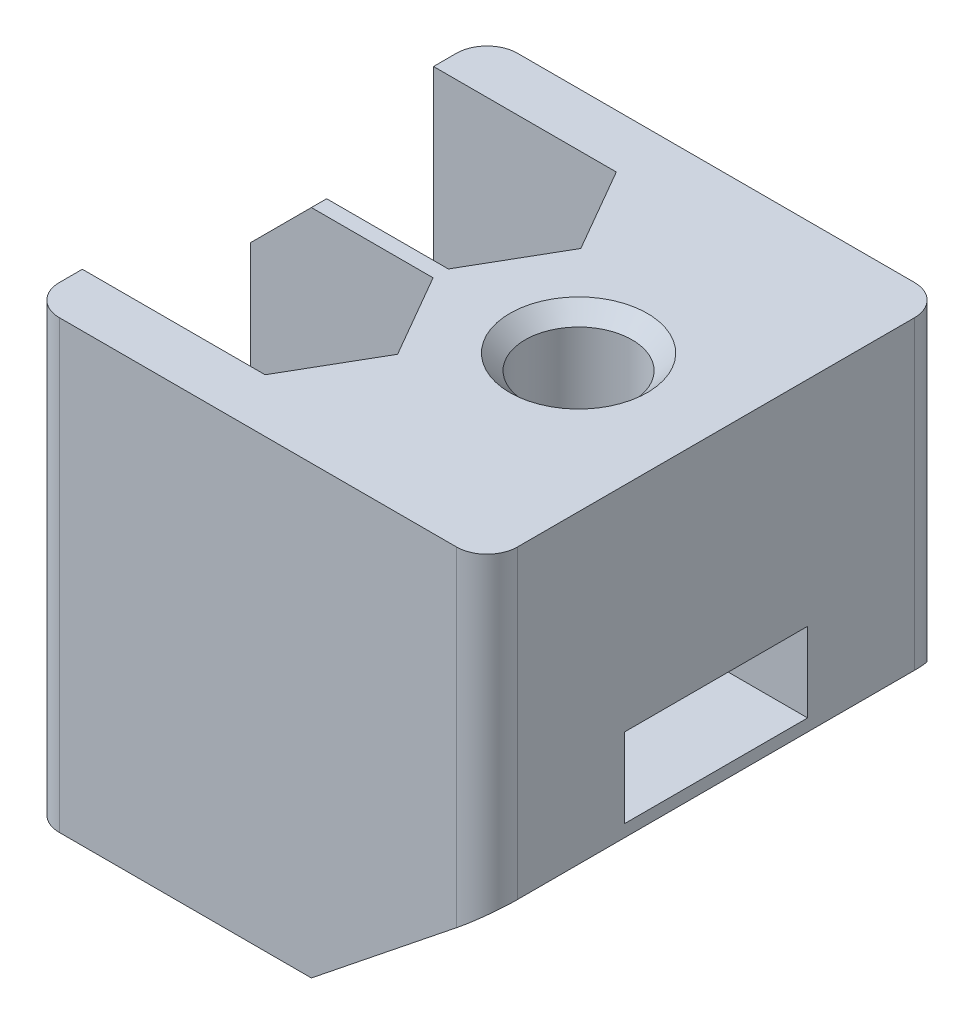
ISO-10303-21;
HEADER;
FILE_DESCRIPTION(('STEP AP214'),'2;1');
FILE_NAME('part.step','',(''),(''),'','','');
FILE_SCHEMA(('AUTOMOTIVE_DESIGN { 1 0 10303 214 1 1 1 1 }'));
ENDSEC;
DATA;
#1=APPLICATION_CONTEXT('core data for automotive mechanical design processes');
#2=APPLICATION_PROTOCOL_DEFINITION('international standard','automotive_design',2000,#1);
#3=PRODUCT_CONTEXT('',#1,'mechanical');
#4=PRODUCT('Part','Part','',(#3));
#5=PRODUCT_RELATED_PRODUCT_CATEGORY('part','',(#4));
#6=PRODUCT_DEFINITION_FORMATION('','',#4);
#7=PRODUCT_DEFINITION_CONTEXT('part definition',#1,'design');
#8=PRODUCT_DEFINITION('design','',#6,#7);
#9=PRODUCT_DEFINITION_SHAPE('','',#8);
#10=(LENGTH_UNIT() NAMED_UNIT(*) SI_UNIT(.MILLI.,.METRE.));
#11=(NAMED_UNIT(*) PLANE_ANGLE_UNIT() SI_UNIT($,.RADIAN.));
#12=(NAMED_UNIT(*) SI_UNIT($,.STERADIAN.) SOLID_ANGLE_UNIT());
#13=UNCERTAINTY_MEASURE_WITH_UNIT(LENGTH_MEASURE(1.E-05),#10,'distance_accuracy_value','');
#14=(GEOMETRIC_REPRESENTATION_CONTEXT(3) GLOBAL_UNCERTAINTY_ASSIGNED_CONTEXT((#13)) GLOBAL_UNIT_ASSIGNED_CONTEXT((#10,
#11,#12)) REPRESENTATION_CONTEXT('',''));
#15=CARTESIAN_POINT('',(0.,0.,0.));
#16=DIRECTION('',(0.,0.,1.));
#17=DIRECTION('',(1.,0.,0.));
#18=AXIS2_PLACEMENT_3D('',#15,#16,#17);
#19=CARTESIAN_POINT('',(1.26794919243112,1.3,3.));
#20=DIRECTION('',(0.,0.,1.));
#21=DIRECTION('',(1.,0.,0.));
#22=AXIS2_PLACEMENT_3D('',#19,#20,#21);
#23=PLANE('',#22);
#24=DIRECTION('',(-1.,0.,0.));
#25=VECTOR('',#24,1.);
#26=CARTESIAN_POINT('',(1.26794919243112,-1.3,3.));
#27=LINE('',#26,#25);
#28=CARTESIAN_POINT('',(7.5,-1.3,3.));
#29=VERTEX_POINT('',#28);
#30=CARTESIAN_POINT('',(1.26794919243112,-1.3,3.));
#31=VERTEX_POINT('',#30);
#32=EDGE_CURVE('E334',#29,#31,#27,.T.);
#33=ORIENTED_EDGE('',*,*,#32,.T.);
#34=DIRECTION('',(0.,-1.,0.));
#35=VECTOR('',#34,1.);
#36=CARTESIAN_POINT('',(1.26794919243112,1.3,3.));
#37=LINE('',#36,#35);
#38=CARTESIAN_POINT('',(1.26794919243112,1.3,3.));
#39=VERTEX_POINT('',#38);
#40=EDGE_CURVE('E367',#39,#31,#37,.T.);
#41=ORIENTED_EDGE('',*,*,#40,.F.);
#42=DIRECTION('',(-1.,0.,0.));
#43=VECTOR('',#42,1.);
#44=CARTESIAN_POINT('',(4.73205080756888,1.3,3.));
#45=LINE('',#44,#43);
#46=CARTESIAN_POINT('',(7.5,1.3,3.));
#47=VERTEX_POINT('',#46);
#48=EDGE_CURVE('E335',#47,#39,#45,.T.);
#49=ORIENTED_EDGE('',*,*,#48,.F.);
#50=DIRECTION('',(0.,-1.,0.));
#51=VECTOR('',#50,1.);
#52=CARTESIAN_POINT('',(7.5,1.3,3.));
#53=LINE('',#52,#51);
#54=EDGE_CURVE('E370',#47,#29,#53,.T.);
#55=ORIENTED_EDGE('',*,*,#54,.T.);
#56=EDGE_LOOP('',(#33,#41,#49,#55));
#57=FACE_BOUND('',#56,.T.);
#58=ADVANCED_FACE('F37',(#57),#23,.F.);
#59=CARTESIAN_POINT('',(-0.464101615137755,1.3,0.));
#60=DIRECTION('',(-0.866025403784438,0.,0.5));
#61=DIRECTION('',(0.5,0.,0.866025403784439));
#62=AXIS2_PLACEMENT_3D('',#59,#60,#61);
#63=PLANE('',#62);
#64=DIRECTION('',(-0.5,0.,-0.866025403784438));
#65=VECTOR('',#64,1.);
#66=CARTESIAN_POINT('',(-0.464101615137755,-1.3,0.));
#67=LINE('',#66,#65);
#68=CARTESIAN_POINT('',(-0.464101615137755,-1.3,0.));
#69=VERTEX_POINT('',#68);
#70=EDGE_CURVE('E351',#31,#69,#67,.T.);
#71=ORIENTED_EDGE('',*,*,#70,.T.);
#72=DIRECTION('',(0.,-1.,0.));
#73=VECTOR('',#72,1.);
#74=CARTESIAN_POINT('',(-0.464101615137755,1.3,0.));
#75=LINE('',#74,#73);
#76=CARTESIAN_POINT('',(-0.464101615137755,1.3,0.));
#77=VERTEX_POINT('',#76);
#78=EDGE_CURVE('E364',#77,#69,#75,.T.);
#79=ORIENTED_EDGE('',*,*,#78,.F.);
#80=DIRECTION('',(-0.5,0.,-0.866025403784438));
#81=VECTOR('',#80,1.);
#82=CARTESIAN_POINT('',(-0.464101615137755,1.3,0.));
#83=LINE('',#82,#81);
#84=EDGE_CURVE('E338',#39,#77,#83,.T.);
#85=ORIENTED_EDGE('',*,*,#84,.F.);
#86=ORIENTED_EDGE('',*,*,#40,.T.);
#87=EDGE_LOOP('',(#71,#79,#85,#86));
#88=FACE_BOUND('',#87,.T.);
#89=ADVANCED_FACE('F520',(#88),#63,.F.);
#90=CARTESIAN_POINT('',(1.26794919243112,1.3,-3.));
#91=DIRECTION('',(-0.866025403784439,0.,-0.5));
#92=DIRECTION('',(-0.5,0.,0.866025403784439));
#93=AXIS2_PLACEMENT_3D('',#90,#91,#92);
#94=PLANE('',#93);
#95=DIRECTION('',(0.5,0.,-0.866025403784439));
#96=VECTOR('',#95,1.);
#97=CARTESIAN_POINT('',(1.26794919243112,-1.3,-3.));
#98=LINE('',#97,#96);
#99=CARTESIAN_POINT('',(1.26794919243112,-1.3,-3.));
#100=VERTEX_POINT('',#99);
#101=EDGE_CURVE('E354',#69,#100,#98,.T.);
#102=ORIENTED_EDGE('',*,*,#101,.T.);
#103=DIRECTION('',(0.,-1.,0.));
#104=VECTOR('',#103,1.);
#105=CARTESIAN_POINT('',(1.26794919243112,1.3,-3.));
#106=LINE('',#105,#104);
#107=CARTESIAN_POINT('',(1.26794919243112,1.3,-3.));
#108=VERTEX_POINT('',#107);
#109=EDGE_CURVE('E361',#108,#100,#106,.T.);
#110=ORIENTED_EDGE('',*,*,#109,.F.);
#111=DIRECTION('',(0.5,0.,-0.866025403784439));
#112=VECTOR('',#111,1.);
#113=CARTESIAN_POINT('',(1.26794919243112,1.3,-3.));
#114=LINE('',#113,#112);
#115=EDGE_CURVE('E342',#77,#108,#114,.T.);
#116=ORIENTED_EDGE('',*,*,#115,.F.);
#117=ORIENTED_EDGE('',*,*,#78,.T.);
#118=EDGE_LOOP('',(#102,#110,#116,#117));
#119=FACE_BOUND('',#118,.T.);
#120=ADVANCED_FACE('F526',(#119),#94,.F.);
#121=CARTESIAN_POINT('',(4.73205080756888,1.3,-3.));
#122=DIRECTION('',(0.,0.,-1.));
#123=DIRECTION('',(-1.,0.,0.));
#124=AXIS2_PLACEMENT_3D('',#121,#122,#123);
#125=PLANE('',#124);
#126=DIRECTION('',(1.,0.,0.));
#127=VECTOR('',#126,1.);
#128=CARTESIAN_POINT('',(4.73205080756888,-1.3,-3.));
#129=LINE('',#128,#127);
#130=CARTESIAN_POINT('',(7.5,-1.3,-3.));
#131=VERTEX_POINT('',#130);
#132=EDGE_CURVE('E339',#100,#131,#129,.T.);
#133=ORIENTED_EDGE('',*,*,#132,.T.);
#134=DIRECTION('',(0.,-1.,0.));
#135=VECTOR('',#134,1.);
#136=CARTESIAN_POINT('',(7.5,1.3,-3.));
#137=LINE('',#136,#135);
#138=CARTESIAN_POINT('',(7.5,1.3,-3.));
#139=VERTEX_POINT('',#138);
#140=EDGE_CURVE('E348',#139,#131,#137,.T.);
#141=ORIENTED_EDGE('',*,*,#140,.F.);
#142=DIRECTION('',(1.,0.,0.));
#143=VECTOR('',#142,1.);
#144=CARTESIAN_POINT('',(4.73205080756888,1.3,-3.));
#145=LINE('',#144,#143);
#146=EDGE_CURVE('E345',#108,#139,#145,.T.);
#147=ORIENTED_EDGE('',*,*,#146,.F.);
#148=ORIENTED_EDGE('',*,*,#109,.T.);
#149=EDGE_LOOP('',(#133,#141,#147,#148));
#150=FACE_BOUND('',#149,.T.);
#151=ADVANCED_FACE('F696',(#150),#125,.F.);
#152=CARTESIAN_POINT('',(7.5,1.3,-7.5));
#153=DIRECTION('',(-1.,0.,0.));
#154=DIRECTION('',(0.,0.,1.));
#155=AXIS2_PLACEMENT_3D('',#152,#153,#154);
#156=PLANE('',#155);
#157=DIRECTION('',(0.,0.,1.));
#158=VECTOR('',#157,1.);
#159=CARTESIAN_POINT('',(7.5,-1.3,3.));
#160=LINE('',#159,#158);
#161=EDGE_CURVE('E280',#131,#29,#160,.T.);
#162=ORIENTED_EDGE('',*,*,#161,.T.);
#163=ORIENTED_EDGE('',*,*,#54,.F.);
#164=DIRECTION('',(0.,0.,-1.));
#165=VECTOR('',#164,1.);
#166=CARTESIAN_POINT('',(7.5,1.3,7.5));
#167=LINE('',#166,#165);
#168=EDGE_CURVE('E331',#47,#139,#167,.T.);
#169=ORIENTED_EDGE('',*,*,#168,.T.);
#170=ORIENTED_EDGE('',*,*,#140,.T.);
#171=EDGE_LOOP('',(#162,#163,#169,#170));
#172=FACE_BOUND('',#171,.T.);
#173=DIRECTION('',(0.,0.,-1.));
#174=VECTOR('',#173,1.);
#175=CARTESIAN_POINT('',(7.5,8.3,2.75000000000001));
#176=LINE('',#175,#174);
#177=CARTESIAN_POINT('',(7.5,8.3,6.5));
#178=VERTEX_POINT('',#177);
#179=CARTESIAN_POINT('',(7.5,8.3,-6.5));
#180=VERTEX_POINT('',#179);
#181=EDGE_CURVE('E283',#178,#180,#176,.T.);
#182=ORIENTED_EDGE('',*,*,#181,.F.);
#183=DIRECTION('',(0.,-1.,0.));
#184=VECTOR('',#183,1.);
#185=CARTESIAN_POINT('',(7.5,1.3,6.5));
#186=LINE('',#185,#184);
#187=CARTESIAN_POINT('',(7.5,-1.7,6.5));
#188=VERTEX_POINT('',#187);
#189=EDGE_CURVE('E394',#178,#188,#186,.T.);
#190=ORIENTED_EDGE('',*,*,#189,.T.);
#191=DIRECTION('',(0.,0.,1.));
#192=VECTOR('',#191,1.);
#193=CARTESIAN_POINT('',(7.5,-1.7,-7.5));
#194=LINE('',#193,#192);
#195=CARTESIAN_POINT('',(7.5,-1.7,-6.5));
#196=VERTEX_POINT('',#195);
#197=EDGE_CURVE('E455',#196,#188,#194,.T.);
#198=ORIENTED_EDGE('',*,*,#197,.F.);
#199=DIRECTION('',(0.,-1.,0.));
#200=VECTOR('',#199,1.);
#201=CARTESIAN_POINT('',(7.5,1.3,-6.5));
#202=LINE('',#201,#200);
#203=EDGE_CURVE('E392',#196,#180,#202,.F.);
#204=ORIENTED_EDGE('',*,*,#203,.T.);
#205=EDGE_LOOP('',(#182,#190,#198,#204));
#206=FACE_BOUND('',#205,.T.);
#207=ADVANCED_FACE('F486',(#172,#206),#156,.F.);
#208=CARTESIAN_POINT('',(-7.5,1.3,-7.5));
#209=DIRECTION('',(0.,0.,1.));
#210=DIRECTION('',(1.,0.,0.));
#211=AXIS2_PLACEMENT_3D('',#208,#209,#210);
#212=PLANE('',#211);
#213=DIRECTION('',(-0.78086880944303,-0.624695047554424,0.));
#214=VECTOR('',#213,1.);
#215=CARTESIAN_POINT('',(0.500000000000004,-7.3,-7.5));
#216=LINE('',#215,#214);
#217=CARTESIAN_POINT('',(6.5,-2.5,-7.5));
#218=VERTEX_POINT('',#217);
#219=CARTESIAN_POINT('',(1.75,-6.3,-7.5));
#220=VERTEX_POINT('',#219);
#221=EDGE_CURVE('E451',#218,#220,#216,.T.);
#222=ORIENTED_EDGE('',*,*,#221,.T.);
#223=DIRECTION('',(-1.,0.,0.));
#224=VECTOR('',#223,1.);
#225=CARTESIAN_POINT('',(-6.5,-6.3,-7.5));
#226=LINE('',#225,#224);
#227=CARTESIAN_POINT('',(-6.5,-6.3,-7.5));
#228=VERTEX_POINT('',#227);
#229=EDGE_CURVE('E434',#220,#228,#226,.T.);
#230=ORIENTED_EDGE('',*,*,#229,.T.);
#231=DIRECTION('',(0.,-1.,0.));
#232=VECTOR('',#231,1.);
#233=CARTESIAN_POINT('',(-6.5,1.3,-7.5));
#234=LINE('',#233,#232);
#235=CARTESIAN_POINT('',(-6.5,8.3,-7.5));
#236=VERTEX_POINT('',#235);
#237=EDGE_CURVE('E421',#228,#236,#234,.F.);
#238=ORIENTED_EDGE('',*,*,#237,.T.);
#239=DIRECTION('',(-1.,0.,0.));
#240=VECTOR('',#239,1.);
#241=CARTESIAN_POINT('',(-7.5,8.3,-7.5));
#242=LINE('',#241,#240);
#243=CARTESIAN_POINT('',(6.5,8.3,-7.5));
#244=VERTEX_POINT('',#243);
#245=EDGE_CURVE('E286',#244,#236,#242,.T.);
#246=ORIENTED_EDGE('',*,*,#245,.F.);
#247=DIRECTION('',(0.,-1.,0.));
#248=VECTOR('',#247,1.);
#249=CARTESIAN_POINT('',(6.5,1.3,-7.5));
#250=LINE('',#249,#248);
#251=EDGE_CURVE('E418',#244,#218,#250,.T.);
#252=ORIENTED_EDGE('',*,*,#251,.T.);
#253=EDGE_LOOP('',(#222,#230,#238,#246,#252));
#254=FACE_BOUND('',#253,.T.);
#255=ADVANCED_FACE('F493',(#254),#212,.F.);
#256=CARTESIAN_POINT('',(-7.5,1.3,5.75));
#257=DIRECTION('',(1.,0.,0.));
#258=DIRECTION('',(0.,0.,-1.));
#259=AXIS2_PLACEMENT_3D('',#256,#257,#258);
#260=PLANE('',#259);
#261=DIRECTION('',(0.,-1.,0.));
#262=VECTOR('',#261,1.);
#263=CARTESIAN_POINT('',(-7.5,1.3,-6.5));
#264=LINE('',#263,#262);
#265=CARTESIAN_POINT('',(-7.5,8.3,-6.5));
#266=VERTEX_POINT('',#265);
#267=CARTESIAN_POINT('',(-7.5,-6.3,-6.5));
#268=VERTEX_POINT('',#267);
#269=EDGE_CURVE('E414',#266,#268,#264,.T.);
#270=ORIENTED_EDGE('',*,*,#269,.T.);
#271=DIRECTION('',(0.,0.,1.));
#272=VECTOR('',#271,1.);
#273=CARTESIAN_POINT('',(-7.5,-6.3,6.5));
#274=LINE('',#273,#272);
#275=CARTESIAN_POINT('',(-7.5,-6.3,6.5));
#276=VERTEX_POINT('',#275);
#277=EDGE_CURVE('E62',#268,#276,#274,.T.);
#278=ORIENTED_EDGE('',*,*,#277,.T.);
#279=DIRECTION('',(0.,-1.,0.));
#280=VECTOR('',#279,1.);
#281=CARTESIAN_POINT('',(-7.5,1.3,6.5));
#282=LINE('',#281,#280);
#283=CARTESIAN_POINT('',(-7.5,8.3,6.5));
#284=VERTEX_POINT('',#283);
#285=EDGE_CURVE('E416',#276,#284,#282,.F.);
#286=ORIENTED_EDGE('',*,*,#285,.T.);
#287=DIRECTION('',(0.,0.,1.));
#288=VECTOR('',#287,1.);
#289=CARTESIAN_POINT('',(-7.5,8.3,5.75));
#290=LINE('',#289,#288);
#291=CARTESIAN_POINT('',(-7.5,8.3,5.75));
#292=VERTEX_POINT('',#291);
#293=EDGE_CURVE('E306',#292,#284,#290,.T.);
#294=ORIENTED_EDGE('',*,*,#293,.F.);
#295=DIRECTION('',(0.,-1.,0.));
#296=VECTOR('',#295,1.);
#297=CARTESIAN_POINT('',(-7.5,8.3,5.75));
#298=LINE('',#297,#296);
#299=CARTESIAN_POINT('',(-7.5,2.7,5.75));
#300=VERTEX_POINT('',#299);
#301=EDGE_CURVE('E312',#292,#300,#298,.T.);
#302=ORIENTED_EDGE('',*,*,#301,.T.);
#303=DIRECTION('',(0.,0.,1.));
#304=VECTOR('',#303,1.);
#305=CARTESIAN_POINT('',(-7.5,2.7,0.250000000000005));
#306=LINE('',#305,#304);
#307=CARTESIAN_POINT('',(-7.5,2.7,0.250000000000005));
#308=VERTEX_POINT('',#307);
#309=EDGE_CURVE('E248',#308,#300,#306,.T.);
#310=ORIENTED_EDGE('',*,*,#309,.F.);
#311=DIRECTION('',(0.,-1.,0.));
#312=VECTOR('',#311,1.);
#313=CARTESIAN_POINT('',(-7.5,8.3,0.250000000000003));
#314=LINE('',#313,#312);
#315=CARTESIAN_POINT('',(-7.5,6.3,0.250000000000003));
#316=VERTEX_POINT('',#315);
#317=EDGE_CURVE('E320',#316,#308,#314,.T.);
#318=ORIENTED_EDGE('',*,*,#317,.F.);
#319=DIRECTION('',(0.,0.,-1.));
#320=VECTOR('',#319,1.);
#321=CARTESIAN_POINT('',(-7.5,6.3,-0.249999999999998));
#322=LINE('',#321,#320);
#323=CARTESIAN_POINT('',(-7.5,6.3,-0.249999999999998));
#324=VERTEX_POINT('',#323);
#325=EDGE_CURVE('E388',#316,#324,#322,.T.);
#326=ORIENTED_EDGE('',*,*,#325,.T.);
#327=DIRECTION('',(0.,-1.,0.));
#328=VECTOR('',#327,1.);
#329=CARTESIAN_POINT('',(-7.5,8.3,-0.249999999999998));
#330=LINE('',#329,#328);
#331=CARTESIAN_POINT('',(-7.5,2.7,-0.249999999999998));
#332=VERTEX_POINT('',#331);
#333=EDGE_CURVE('E232',#324,#332,#330,.T.);
#334=ORIENTED_EDGE('',*,*,#333,.T.);
#335=DIRECTION('',(0.,0.,1.));
#336=VECTOR('',#335,1.);
#337=CARTESIAN_POINT('',(-7.5,2.7,-5.75));
#338=LINE('',#337,#336);
#339=CARTESIAN_POINT('',(-7.5,2.7,-5.75));
#340=VERTEX_POINT('',#339);
#341=EDGE_CURVE('E247',#340,#332,#338,.T.);
#342=ORIENTED_EDGE('',*,*,#341,.F.);
#343=DIRECTION('',(0.,-1.,0.));
#344=VECTOR('',#343,1.);
#345=CARTESIAN_POINT('',(-7.5,8.3,-5.75));
#346=LINE('',#345,#344);
#347=CARTESIAN_POINT('',(-7.5,8.3,-5.75));
#348=VERTEX_POINT('',#347);
#349=EDGE_CURVE('E326',#348,#340,#346,.T.);
#350=ORIENTED_EDGE('',*,*,#349,.F.);
#351=DIRECTION('',(0.,0.,1.));
#352=VECTOR('',#351,1.);
#353=CARTESIAN_POINT('',(-7.5,8.3,-7.5));
#354=LINE('',#353,#352);
#355=EDGE_CURVE('E289',#266,#348,#354,.T.);
#356=ORIENTED_EDGE('',*,*,#355,.F.);
#357=EDGE_LOOP('',(#270,#278,#286,#294,#302,#310,#318,#326,#334,#342,#350,#356));
#358=FACE_BOUND('',#357,.T.);
#359=ADVANCED_FACE('F640',(#358),#260,.F.);
#360=CARTESIAN_POINT('',(-7.5,1.3,7.5));
#361=DIRECTION('',(0.,0.,-1.));
#362=DIRECTION('',(-1.,0.,0.));
#363=AXIS2_PLACEMENT_3D('',#360,#361,#362);
#364=PLANE('',#363);
#365=DIRECTION('',(0.,-1.,0.));
#366=VECTOR('',#365,1.);
#367=CARTESIAN_POINT('',(-6.5,1.3,7.5));
#368=LINE('',#367,#366);
#369=CARTESIAN_POINT('',(-6.5,8.3,7.5));
#370=VERTEX_POINT('',#369);
#371=CARTESIAN_POINT('',(-6.5,-6.3,7.5));
#372=VERTEX_POINT('',#371);
#373=EDGE_CURVE('E402',#370,#372,#368,.T.);
#374=ORIENTED_EDGE('',*,*,#373,.T.);
#375=DIRECTION('',(1.,0.,0.));
#376=VECTOR('',#375,1.);
#377=CARTESIAN_POINT('',(0.500000000000004,-6.3,7.5));
#378=LINE('',#377,#376);
#379=CARTESIAN_POINT('',(1.75000000000001,-6.3,7.5));
#380=VERTEX_POINT('',#379);
#381=EDGE_CURVE('E12',#372,#380,#378,.T.);
#382=ORIENTED_EDGE('',*,*,#381,.T.);
#383=DIRECTION('',(0.78086880944303,0.624695047554425,0.));
#384=VECTOR('',#383,1.);
#385=CARTESIAN_POINT('',(-0.182926829268287,-7.84634146341463,7.5));
#386=LINE('',#385,#384);
#387=CARTESIAN_POINT('',(6.5,-2.5,7.5));
#388=VERTEX_POINT('',#387);
#389=EDGE_CURVE('E255',#380,#388,#386,.T.);
#390=ORIENTED_EDGE('',*,*,#389,.T.);
#391=DIRECTION('',(0.,-1.,0.));
#392=VECTOR('',#391,1.);
#393=CARTESIAN_POINT('',(6.5,1.3,7.5));
#394=LINE('',#393,#392);
#395=CARTESIAN_POINT('',(6.5,8.3,7.5));
#396=VERTEX_POINT('',#395);
#397=EDGE_CURVE('E404',#388,#396,#394,.F.);
#398=ORIENTED_EDGE('',*,*,#397,.T.);
#399=DIRECTION('',(1.,0.,0.));
#400=VECTOR('',#399,1.);
#401=CARTESIAN_POINT('',(-7.5,8.3,7.5));
#402=LINE('',#401,#400);
#403=EDGE_CURVE('E309',#370,#396,#402,.T.);
#404=ORIENTED_EDGE('',*,*,#403,.F.);
#405=EDGE_LOOP('',(#374,#382,#390,#398,#404));
#406=FACE_BOUND('',#405,.T.);
#407=ADVANCED_FACE('F469',(#406),#364,.F.);
#408=CARTESIAN_POINT('',(0.,1.3,0.));
#409=DIRECTION('',(0.,1.,0.));
#410=DIRECTION('',(0.,0.,1.));
#411=AXIS2_PLACEMENT_3D('',#408,#409,#410);
#412=PLANE('',#411);
#413=CARTESIAN_POINT('',(3.,1.3,0.));
#414=DIRECTION('',(0.,1.,0.));
#415=DIRECTION('',(0.,0.,1.));
#416=AXIS2_PLACEMENT_3D('',#413,#414,#415);
#417=CIRCLE('',#416,1.75);
#418=CARTESIAN_POINT('',(3.,1.3,1.75));
#419=VERTEX_POINT('',#418);
#420=EDGE_CURVE('E328',#419,#419,#417,.T.);
#421=ORIENTED_EDGE('',*,*,#420,.T.);
#422=EDGE_LOOP('',(#421));
#423=FACE_BOUND('',#422,.T.);
#424=ORIENTED_EDGE('',*,*,#168,.F.);
#425=ORIENTED_EDGE('',*,*,#48,.T.);
#426=ORIENTED_EDGE('',*,*,#84,.T.);
#427=ORIENTED_EDGE('',*,*,#115,.T.);
#428=ORIENTED_EDGE('',*,*,#146,.T.);
#429=EDGE_LOOP('',(#424,#425,#426,#427,#428));
#430=FACE_BOUND('',#429,.T.);
#431=ADVANCED_FACE('F639',(#423,#430),#412,.F.);
#432=CARTESIAN_POINT('',(-3.10245852095694,-1.3,-3.));
#433=DIRECTION('',(0.,1.,0.));
#434=DIRECTION('',(0.,0.,1.));
#435=AXIS2_PLACEMENT_3D('',#432,#433,#434);
#436=CYLINDRICAL_SURFACE('',#435,1.75);
#437=CARTESIAN_POINT('',(-3.10245852095694,2.7,-3.));
#438=DIRECTION('',(0.,-1.,0.));
#439=DIRECTION('',(0.,0.,-1.));
#440=AXIS2_PLACEMENT_3D('',#437,#438,#439);
#441=CIRCLE('',#440,1.75);
#442=CARTESIAN_POINT('',(-3.10245852095694,2.7,-4.75));
#443=VERTEX_POINT('',#442);
#444=EDGE_CURVE('E277',#443,#443,#441,.F.);
#445=ORIENTED_EDGE('',*,*,#444,.T.);
#446=EDGE_LOOP('',(#445));
#447=FACE_BOUND('',#446,.T.);
#448=CARTESIAN_POINT('',(-3.10245852095694,-7.3,-3.));
#449=DIRECTION('',(0.,-1.,0.));
#450=DIRECTION('',(0.,0.,-1.));
#451=AXIS2_PLACEMENT_3D('',#448,#449,#450);
#452=CIRCLE('',#451,1.75);
#453=CARTESIAN_POINT('',(-3.10245852095694,-7.3,-4.75));
#454=VERTEX_POINT('',#453);
#455=EDGE_CURVE('E273',#454,#454,#452,.T.);
#456=ORIENTED_EDGE('',*,*,#455,.T.);
#457=EDGE_LOOP('',(#456));
#458=FACE_BOUND('',#457,.T.);
#459=ADVANCED_FACE('F822',(#447,#458),#436,.F.);
#460=CARTESIAN_POINT('',(-3.10245852095694,-1.3,3.));
#461=DIRECTION('',(0.,1.,0.));
#462=DIRECTION('',(0.,0.,1.));
#463=AXIS2_PLACEMENT_3D('',#460,#461,#462);
#464=CYLINDRICAL_SURFACE('',#463,1.75);
#465=CARTESIAN_POINT('',(-3.10245852095694,2.7,3.));
#466=DIRECTION('',(0.,-1.,0.));
#467=DIRECTION('',(0.,0.,-1.));
#468=AXIS2_PLACEMENT_3D('',#465,#466,#467);
#469=CIRCLE('',#468,1.75);
#470=CARTESIAN_POINT('',(-3.10245852095694,2.7,1.25));
#471=VERTEX_POINT('',#470);
#472=EDGE_CURVE('E258',#471,#471,#469,.F.);
#473=ORIENTED_EDGE('',*,*,#472,.T.);
#474=EDGE_LOOP('',(#473));
#475=FACE_BOUND('',#474,.T.);
#476=CARTESIAN_POINT('',(-3.10245852095694,-7.3,3.));
#477=DIRECTION('',(0.,-1.,0.));
#478=DIRECTION('',(0.,0.,-1.));
#479=AXIS2_PLACEMENT_3D('',#476,#477,#478);
#480=CIRCLE('',#479,1.75);
#481=CARTESIAN_POINT('',(-3.10245852095694,-7.3,1.25));
#482=VERTEX_POINT('',#481);
#483=EDGE_CURVE('E276',#482,#482,#480,.T.);
#484=ORIENTED_EDGE('',*,*,#483,.T.);
#485=EDGE_LOOP('',(#484));
#486=FACE_BOUND('',#485,.T.);
#487=ADVANCED_FACE('F741',(#475,#486),#464,.F.);
#488=CARTESIAN_POINT('',(3.,-1.3,0.));
#489=DIRECTION('',(0.,1.,0.));
#490=DIRECTION('',(0.,0.,1.));
#491=AXIS2_PLACEMENT_3D('',#488,#489,#490);
#492=CYLINDRICAL_SURFACE('',#491,1.75);
#493=CARTESIAN_POINT('',(3.,7.8,0.));
#494=DIRECTION('',(0.,1.,0.));
#495=DIRECTION('',(0.,0.,1.));
#496=AXIS2_PLACEMENT_3D('',#493,#494,#495);
#497=CIRCLE('',#496,1.75);
#498=CARTESIAN_POINT('',(3.,7.8,1.75));
#499=VERTEX_POINT('',#498);
#500=EDGE_CURVE('E373',#499,#499,#497,.T.);
#501=ORIENTED_EDGE('',*,*,#500,.T.);
#502=EDGE_LOOP('',(#501));
#503=FACE_BOUND('',#502,.T.);
#504=ORIENTED_EDGE('',*,*,#420,.F.);
#505=EDGE_LOOP('',(#504));
#506=FACE_BOUND('',#505,.T.);
#507=ADVANCED_FACE('F684',(#503,#506),#492,.F.);
#508=CARTESIAN_POINT('',(0.,8.3,0.));
#509=DIRECTION('',(0.,1.,0.));
#510=DIRECTION('',(0.,0.,1.));
#511=AXIS2_PLACEMENT_3D('',#508,#509,#510);
#512=PLANE('',#511);
#513=CARTESIAN_POINT('',(3.,8.3,0.));
#514=DIRECTION('',(0.,1.,0.));
#515=DIRECTION('',(0.,0.,1.));
#516=AXIS2_PLACEMENT_3D('',#513,#514,#515);
#517=CIRCLE('',#516,2.25);
#518=CARTESIAN_POINT('',(3.,8.3,2.25));
#519=VERTEX_POINT('',#518);
#520=EDGE_CURVE('E380',#519,#519,#517,.F.);
#521=ORIENTED_EDGE('',*,*,#520,.T.);
#522=EDGE_LOOP('',(#521));
#523=FACE_BOUND('',#522,.T.);
#524=ORIENTED_EDGE('',*,*,#403,.T.);
#525=CARTESIAN_POINT('',(6.5,8.3,6.5));
#526=DIRECTION('',(0.,1.,0.));
#527=DIRECTION('',(0.,0.,1.));
#528=AXIS2_PLACEMENT_3D('',#525,#526,#527);
#529=CIRCLE('',#528,1.);
#530=EDGE_CURVE('E412',#396,#178,#529,.T.);
#531=ORIENTED_EDGE('',*,*,#530,.T.);
#532=ORIENTED_EDGE('',*,*,#181,.T.);
#533=CARTESIAN_POINT('',(6.5,8.3,-6.5));
#534=DIRECTION('',(0.,1.,0.));
#535=DIRECTION('',(0.,0.,1.));
#536=AXIS2_PLACEMENT_3D('',#533,#534,#535);
#537=CIRCLE('',#536,1.);
#538=EDGE_CURVE('E406',#180,#244,#537,.T.);
#539=ORIENTED_EDGE('',*,*,#538,.T.);
#540=ORIENTED_EDGE('',*,*,#245,.T.);
#541=CARTESIAN_POINT('',(-6.5,8.3,-6.5));
#542=DIRECTION('',(0.,1.,0.));
#543=DIRECTION('',(0.,0.,1.));
#544=AXIS2_PLACEMENT_3D('',#541,#542,#543);
#545=CIRCLE('',#544,1.);
#546=EDGE_CURVE('E408',#236,#266,#545,.T.);
#547=ORIENTED_EDGE('',*,*,#546,.T.);
#548=ORIENTED_EDGE('',*,*,#355,.T.);
#549=DIRECTION('',(1.,0.,0.));
#550=VECTOR('',#549,1.);
#551=CARTESIAN_POINT('',(-4.69017176122841,8.3,-5.75));
#552=LINE('',#551,#550);
#553=CARTESIAN_POINT('',(-1.51474528068547,8.3,-5.75));
#554=VERTEX_POINT('',#553);
#555=EDGE_CURVE('E291',#348,#554,#552,.T.);
#556=ORIENTED_EDGE('',*,*,#555,.T.);
#557=DIRECTION('',(0.5,0.,0.866025403784439));
#558=VECTOR('',#557,1.);
#559=CARTESIAN_POINT('',(0.0729679595860011,8.3,-3.));
#560=LINE('',#559,#558);
#561=CARTESIAN_POINT('',(0.0729679595860011,8.3,-3.));
#562=VERTEX_POINT('',#561);
#563=EDGE_CURVE('E293',#554,#562,#560,.T.);
#564=ORIENTED_EDGE('',*,*,#563,.T.);
#565=DIRECTION('',(-0.5,0.,0.866025403784439));
#566=VECTOR('',#565,1.);
#567=CARTESIAN_POINT('',(-1.51474528068547,8.3,-0.249999999999997));
#568=LINE('',#567,#566);
#569=CARTESIAN_POINT('',(-1.51474528068547,8.3,-0.249999999999997));
#570=VERTEX_POINT('',#569);
#571=EDGE_CURVE('E295',#562,#570,#568,.T.);
#572=ORIENTED_EDGE('',*,*,#571,.T.);
#573=DIRECTION('',(-1.,0.,0.));
#574=VECTOR('',#573,1.);
#575=CARTESIAN_POINT('',(-4.69017176122841,8.3,-0.249999999999997));
#576=LINE('',#575,#574);
#577=CARTESIAN_POINT('',(-5.50000000000001,8.3,-0.249999999999997));
#578=VERTEX_POINT('',#577);
#579=EDGE_CURVE('E228',#570,#578,#576,.T.);
#580=ORIENTED_EDGE('',*,*,#579,.T.);
#581=DIRECTION('',(0.,0.,1.));
#582=VECTOR('',#581,1.);
#583=CARTESIAN_POINT('',(-5.50000000000001,8.3,0.250000000000003));
#584=LINE('',#583,#582);
#585=CARTESIAN_POINT('',(-5.50000000000001,8.3,0.250000000000004));
#586=VERTEX_POINT('',#585);
#587=EDGE_CURVE('E383',#578,#586,#584,.T.);
#588=ORIENTED_EDGE('',*,*,#587,.T.);
#589=DIRECTION('',(1.,0.,0.));
#590=VECTOR('',#589,1.);
#591=CARTESIAN_POINT('',(-4.69017176122841,8.3,0.250000000000005));
#592=LINE('',#591,#590);
#593=CARTESIAN_POINT('',(-1.51474528068547,8.3,0.250000000000005));
#594=VERTEX_POINT('',#593);
#595=EDGE_CURVE('E298',#586,#594,#592,.T.);
#596=ORIENTED_EDGE('',*,*,#595,.T.);
#597=DIRECTION('',(0.5,0.,0.866025403784438));
#598=VECTOR('',#597,1.);
#599=CARTESIAN_POINT('',(0.0729679595859998,8.3,3.));
#600=LINE('',#599,#598);
#601=CARTESIAN_POINT('',(0.0729679595859998,8.3,3.));
#602=VERTEX_POINT('',#601);
#603=EDGE_CURVE('E300',#594,#602,#600,.T.);
#604=ORIENTED_EDGE('',*,*,#603,.T.);
#605=DIRECTION('',(-0.5,0.,0.866025403784439));
#606=VECTOR('',#605,1.);
#607=CARTESIAN_POINT('',(-1.51474528068547,8.3,5.75));
#608=LINE('',#607,#606);
#609=CARTESIAN_POINT('',(-1.51474528068547,8.3,5.75));
#610=VERTEX_POINT('',#609);
#611=EDGE_CURVE('E302',#602,#610,#608,.T.);
#612=ORIENTED_EDGE('',*,*,#611,.T.);
#613=DIRECTION('',(-1.,0.,0.));
#614=VECTOR('',#613,1.);
#615=CARTESIAN_POINT('',(-4.69017176122841,8.3,5.75));
#616=LINE('',#615,#614);
#617=EDGE_CURVE('E304',#610,#292,#616,.T.);
#618=ORIENTED_EDGE('',*,*,#617,.T.);
#619=ORIENTED_EDGE('',*,*,#293,.T.);
#620=CARTESIAN_POINT('',(-6.5,8.3,6.5));
#621=DIRECTION('',(0.,1.,0.));
#622=DIRECTION('',(0.,0.,1.));
#623=AXIS2_PLACEMENT_3D('',#620,#621,#622);
#624=CIRCLE('',#623,1.);
#625=EDGE_CURVE('E410',#284,#370,#624,.T.);
#626=ORIENTED_EDGE('',*,*,#625,.T.);
#627=EDGE_LOOP('',(#524,#531,#532,#539,#540,#547,#548,#556,#564,#572,#580,#588,#596,#604,#612,
#618,#619,#626));
#628=FACE_BOUND('',#627,.T.);
#629=ADVANCED_FACE('F483',(#523,#628),#512,.T.);
#630=CARTESIAN_POINT('',(-1.51474528068547,8.3,-5.75));
#631=DIRECTION('',(0.,0.,-1.));
#632=DIRECTION('',(-1.,0.,0.));
#633=AXIS2_PLACEMENT_3D('',#630,#631,#632);
#634=PLANE('',#633);
#635=ORIENTED_EDGE('',*,*,#349,.T.);
#636=DIRECTION('',(-1.,0.,0.));
#637=VECTOR('',#636,1.);
#638=CARTESIAN_POINT('',(-1.51474528068547,2.7,-5.75));
#639=LINE('',#638,#637);
#640=CARTESIAN_POINT('',(-1.51474528068547,2.7,-5.75));
#641=VERTEX_POINT('',#640);
#642=EDGE_CURVE('E259',#641,#340,#639,.T.);
#643=ORIENTED_EDGE('',*,*,#642,.F.);
#644=DIRECTION('',(0.,-1.,0.));
#645=VECTOR('',#644,1.);
#646=CARTESIAN_POINT('',(-1.51474528068547,8.3,-5.75));
#647=LINE('',#646,#645);
#648=EDGE_CURVE('E324',#554,#641,#647,.T.);
#649=ORIENTED_EDGE('',*,*,#648,.F.);
#650=ORIENTED_EDGE('',*,*,#555,.F.);
#651=EDGE_LOOP('',(#635,#643,#649,#650));
#652=FACE_BOUND('',#651,.T.);
#653=ADVANCED_FACE('F683',(#652),#634,.F.);
#654=CARTESIAN_POINT('',(0.0729679595860011,8.3,-3.));
#655=DIRECTION('',(0.866025403784439,0.,-0.5));
#656=DIRECTION('',(-0.5,0.,-0.866025403784439));
#657=AXIS2_PLACEMENT_3D('',#654,#655,#656);
#658=PLANE('',#657);
#659=ORIENTED_EDGE('',*,*,#648,.T.);
#660=DIRECTION('',(-0.5,0.,-0.866025403784439));
#661=VECTOR('',#660,1.);
#662=CARTESIAN_POINT('',(0.0729679595860011,2.7,-3.));
#663=LINE('',#662,#661);
#664=CARTESIAN_POINT('',(0.0729679595860013,2.7,-3.));
#665=VERTEX_POINT('',#664);
#666=EDGE_CURVE('E241',#665,#641,#663,.T.);
#667=ORIENTED_EDGE('',*,*,#666,.F.);
#668=DIRECTION('',(0.,-1.,0.));
#669=VECTOR('',#668,1.);
#670=CARTESIAN_POINT('',(0.0729679595860011,8.3,-3.));
#671=LINE('',#670,#669);
#672=EDGE_CURVE('E231',#562,#665,#671,.T.);
#673=ORIENTED_EDGE('',*,*,#672,.F.);
#674=ORIENTED_EDGE('',*,*,#563,.F.);
#675=EDGE_LOOP('',(#659,#667,#673,#674));
#676=FACE_BOUND('',#675,.T.);
#677=ADVANCED_FACE('F795',(#676),#658,.F.);
#678=CARTESIAN_POINT('',(-1.51474528068547,8.3,-0.249999999999997));
#679=DIRECTION('',(0.866025403784439,0.,0.5));
#680=DIRECTION('',(0.5,0.,-0.866025403784439));
#681=AXIS2_PLACEMENT_3D('',#678,#679,#680);
#682=PLANE('',#681);
#683=ORIENTED_EDGE('',*,*,#672,.T.);
#684=DIRECTION('',(0.5,0.,-0.866025403784439));
#685=VECTOR('',#684,1.);
#686=CARTESIAN_POINT('',(-1.51474528068547,2.7,-0.249999999999997));
#687=LINE('',#686,#685);
#688=CARTESIAN_POINT('',(-1.51474528068547,2.69999999999999,-0.249999999999997));
#689=VERTEX_POINT('',#688);
#690=EDGE_CURVE('E235',#689,#665,#687,.T.);
#691=ORIENTED_EDGE('',*,*,#690,.F.);
#692=DIRECTION('',(0.,-1.,0.));
#693=VECTOR('',#692,1.);
#694=CARTESIAN_POINT('',(-1.51474528068547,8.3,-0.249999999999997));
#695=LINE('',#694,#693);
#696=EDGE_CURVE('E220',#570,#689,#695,.T.);
#697=ORIENTED_EDGE('',*,*,#696,.F.);
#698=ORIENTED_EDGE('',*,*,#571,.F.);
#699=EDGE_LOOP('',(#683,#691,#697,#698));
#700=FACE_BOUND('',#699,.T.);
#701=ADVANCED_FACE('F236',(#700),#682,.F.);
#702=CARTESIAN_POINT('',(-4.69017176122841,8.3,-0.249999999999997));
#703=DIRECTION('',(0.,0.,1.));
#704=DIRECTION('',(1.,0.,0.));
#705=AXIS2_PLACEMENT_3D('',#702,#703,#704);
#706=PLANE('',#705);
#707=ORIENTED_EDGE('',*,*,#333,.F.);
#708=DIRECTION('',(0.707106781186546,0.707106781186549,0.));
#709=VECTOR('',#708,1.);
#710=CARTESIAN_POINT('',(-5.50000000000001,8.3,-0.249999999999997));
#711=LINE('',#710,#709);
#712=EDGE_CURVE('E390',#324,#578,#711,.T.);
#713=ORIENTED_EDGE('',*,*,#712,.T.);
#714=ORIENTED_EDGE('',*,*,#579,.F.);
#715=ORIENTED_EDGE('',*,*,#696,.T.);
#716=DIRECTION('',(1.,0.,0.));
#717=VECTOR('',#716,1.);
#718=CARTESIAN_POINT('',(-7.5,2.7,-0.249999999999998));
#719=LINE('',#718,#717);
#720=EDGE_CURVE('E225',#332,#689,#719,.T.);
#721=ORIENTED_EDGE('',*,*,#720,.F.);
#722=EDGE_LOOP('',(#707,#713,#714,#715,#721));
#723=FACE_BOUND('',#722,.T.);
#724=ADVANCED_FACE('F223',(#723),#706,.F.);
#725=CARTESIAN_POINT('',(-1.51474528068547,8.3,0.250000000000005));
#726=DIRECTION('',(0.,0.,-1.));
#727=DIRECTION('',(-1.,0.,0.));
#728=AXIS2_PLACEMENT_3D('',#725,#726,#727);
#729=PLANE('',#728);
#730=ORIENTED_EDGE('',*,*,#595,.F.);
#731=DIRECTION('',(-0.707106781186546,-0.707106781186549,0.));
#732=VECTOR('',#731,1.);
#733=CARTESIAN_POINT('',(-5.50000000000001,8.3,0.250000000000004));
#734=LINE('',#733,#732);
#735=EDGE_CURVE('E386',#586,#316,#734,.T.);
#736=ORIENTED_EDGE('',*,*,#735,.T.);
#737=ORIENTED_EDGE('',*,*,#317,.T.);
#738=DIRECTION('',(-1.,0.,0.));
#739=VECTOR('',#738,1.);
#740=CARTESIAN_POINT('',(-1.51474528068547,2.7,0.250000000000005));
#741=LINE('',#740,#739);
#742=CARTESIAN_POINT('',(-1.51474528068547,2.7,0.250000000000005));
#743=VERTEX_POINT('',#742);
#744=EDGE_CURVE('E251',#743,#308,#741,.T.);
#745=ORIENTED_EDGE('',*,*,#744,.F.);
#746=DIRECTION('',(0.,-1.,0.));
#747=VECTOR('',#746,1.);
#748=CARTESIAN_POINT('',(-1.51474528068547,8.3,0.250000000000005));
#749=LINE('',#748,#747);
#750=EDGE_CURVE('E318',#594,#743,#749,.T.);
#751=ORIENTED_EDGE('',*,*,#750,.F.);
#752=EDGE_LOOP('',(#730,#736,#737,#745,#751));
#753=FACE_BOUND('',#752,.T.);
#754=ADVANCED_FACE('F709',(#753),#729,.F.);
#755=CARTESIAN_POINT('',(0.0729679595859998,8.3,3.));
#756=DIRECTION('',(0.866025403784438,0.,-0.5));
#757=DIRECTION('',(-0.5,0.,-0.866025403784439));
#758=AXIS2_PLACEMENT_3D('',#755,#756,#757);
#759=PLANE('',#758);
#760=ORIENTED_EDGE('',*,*,#750,.T.);
#761=DIRECTION('',(-0.5,0.,-0.866025403784439));
#762=VECTOR('',#761,1.);
#763=CARTESIAN_POINT('',(0.0729679595859998,2.7,3.));
#764=LINE('',#763,#762);
#765=CARTESIAN_POINT('',(0.0729679595859998,2.7,3.));
#766=VERTEX_POINT('',#765);
#767=EDGE_CURVE('E268',#766,#743,#764,.T.);
#768=ORIENTED_EDGE('',*,*,#767,.F.);
#769=DIRECTION('',(0.,-1.,0.));
#770=VECTOR('',#769,1.);
#771=CARTESIAN_POINT('',(0.0729679595859998,8.3,3.));
#772=LINE('',#771,#770);
#773=EDGE_CURVE('E316',#602,#766,#772,.T.);
#774=ORIENTED_EDGE('',*,*,#773,.F.);
#775=ORIENTED_EDGE('',*,*,#603,.F.);
#776=EDGE_LOOP('',(#760,#768,#774,#775));
#777=FACE_BOUND('',#776,.T.);
#778=ADVANCED_FACE('F714',(#777),#759,.F.);
#779=CARTESIAN_POINT('',(-1.51474528068547,8.3,5.75));
#780=DIRECTION('',(0.866025403784439,0.,0.5));
#781=DIRECTION('',(0.5,0.,-0.866025403784439));
#782=AXIS2_PLACEMENT_3D('',#779,#780,#781);
#783=PLANE('',#782);
#784=ORIENTED_EDGE('',*,*,#773,.T.);
#785=DIRECTION('',(0.5,0.,-0.866025403784439));
#786=VECTOR('',#785,1.);
#787=CARTESIAN_POINT('',(-1.51474528068547,2.7,5.75));
#788=LINE('',#787,#786);
#789=CARTESIAN_POINT('',(-1.51474528068547,2.69999999999999,5.75));
#790=VERTEX_POINT('',#789);
#791=EDGE_CURVE('E264',#790,#766,#788,.T.);
#792=ORIENTED_EDGE('',*,*,#791,.F.);
#793=DIRECTION('',(0.,-1.,0.));
#794=VECTOR('',#793,1.);
#795=CARTESIAN_POINT('',(-1.51474528068547,8.3,5.75));
#796=LINE('',#795,#794);
#797=EDGE_CURVE('E314',#610,#790,#796,.T.);
#798=ORIENTED_EDGE('',*,*,#797,.F.);
#799=ORIENTED_EDGE('',*,*,#611,.F.);
#800=EDGE_LOOP('',(#784,#792,#798,#799));
#801=FACE_BOUND('',#800,.T.);
#802=ADVANCED_FACE('F768',(#801),#783,.F.);
#803=CARTESIAN_POINT('',(-4.69017176122841,8.3,5.75));
#804=DIRECTION('',(0.,0.,1.));
#805=DIRECTION('',(1.,0.,0.));
#806=AXIS2_PLACEMENT_3D('',#803,#804,#805);
#807=PLANE('',#806);
#808=ORIENTED_EDGE('',*,*,#797,.T.);
#809=DIRECTION('',(1.,0.,0.));
#810=VECTOR('',#809,1.);
#811=CARTESIAN_POINT('',(-7.5,2.7,5.75));
#812=LINE('',#811,#810);
#813=EDGE_CURVE('E262',#300,#790,#812,.T.);
#814=ORIENTED_EDGE('',*,*,#813,.F.);
#815=ORIENTED_EDGE('',*,*,#301,.F.);
#816=ORIENTED_EDGE('',*,*,#617,.F.);
#817=EDGE_LOOP('',(#808,#814,#815,#816));
#818=FACE_BOUND('',#817,.T.);
#819=ADVANCED_FACE('F626',(#818),#807,.F.);
#820=CARTESIAN_POINT('',(0.,-7.3,0.));
#821=DIRECTION('',(0.,-1.,0.));
#822=DIRECTION('',(0.,0.,-1.));
#823=AXIS2_PLACEMENT_3D('',#820,#821,#822);
#824=PLANE('',#823);
#825=DIRECTION('',(0.,0.,-1.));
#826=VECTOR('',#825,1.);
#827=CARTESIAN_POINT('',(-6.5,-7.3,-6.5));
#828=LINE('',#827,#826);
#829=CARTESIAN_POINT('',(-6.5,-7.3,6.5));
#830=VERTEX_POINT('',#829);
#831=CARTESIAN_POINT('',(-6.5,-7.3,-6.5));
#832=VERTEX_POINT('',#831);
#833=EDGE_CURVE('E425',#830,#832,#828,.T.);
#834=ORIENTED_EDGE('',*,*,#833,.T.);
#835=DIRECTION('',(1.,0.,0.));
#836=VECTOR('',#835,1.);
#837=CARTESIAN_POINT('',(0.500000000000004,-7.3,-6.5));
#838=LINE('',#837,#836);
#839=CARTESIAN_POINT('',(0.500000000000004,-7.3,-6.5));
#840=VERTEX_POINT('',#839);
#841=EDGE_CURVE('E427',#832,#840,#838,.T.);
#842=ORIENTED_EDGE('',*,*,#841,.T.);
#843=DIRECTION('',(0.,0.,1.));
#844=VECTOR('',#843,1.);
#845=CARTESIAN_POINT('',(0.500000000000004,-7.3,-7.5));
#846=LINE('',#845,#844);
#847=CARTESIAN_POINT('',(0.500000000000004,-7.3,6.5));
#848=VERTEX_POINT('',#847);
#849=EDGE_CURVE('E461',#840,#848,#846,.T.);
#850=ORIENTED_EDGE('',*,*,#849,.T.);
#851=DIRECTION('',(-1.,0.,0.));
#852=VECTOR('',#851,1.);
#853=CARTESIAN_POINT('',(-6.5,-7.3,6.5));
#854=LINE('',#853,#852);
#855=EDGE_CURVE('E423',#848,#830,#854,.T.);
#856=ORIENTED_EDGE('',*,*,#855,.T.);
#857=EDGE_LOOP('',(#834,#842,#850,#856));
#858=FACE_BOUND('',#857,.T.);
#859=ORIENTED_EDGE('',*,*,#483,.F.);
#860=EDGE_LOOP('',(#859));
#861=FACE_BOUND('',#860,.T.);
#862=ORIENTED_EDGE('',*,*,#455,.F.);
#863=EDGE_LOOP('',(#862));
#864=FACE_BOUND('',#863,.T.);
#865=ADVANCED_FACE('F506',(#858,#861,#864),#824,.T.);
#866=CARTESIAN_POINT('',(0.,-1.3,0.));
#867=DIRECTION('',(0.,-1.,0.));
#868=DIRECTION('',(0.,0.,-1.));
#869=AXIS2_PLACEMENT_3D('',#866,#867,#868);
#870=PLANE('',#869);
#871=ORIENTED_EDGE('',*,*,#132,.F.);
#872=ORIENTED_EDGE('',*,*,#101,.F.);
#873=ORIENTED_EDGE('',*,*,#70,.F.);
#874=ORIENTED_EDGE('',*,*,#32,.F.);
#875=ORIENTED_EDGE('',*,*,#161,.F.);
#876=EDGE_LOOP('',(#871,#872,#873,#874,#875));
#877=FACE_BOUND('',#876,.T.);
#878=ADVANCED_FACE('F625',(#877),#870,.F.);
#879=CARTESIAN_POINT('',(0.,2.7,0.));
#880=DIRECTION('',(0.,-1.,0.));
#881=DIRECTION('',(0.,0.,-1.));
#882=AXIS2_PLACEMENT_3D('',#879,#880,#881);
#883=PLANE('',#882);
#884=ORIENTED_EDGE('',*,*,#309,.T.);
#885=ORIENTED_EDGE('',*,*,#813,.T.);
#886=ORIENTED_EDGE('',*,*,#791,.T.);
#887=ORIENTED_EDGE('',*,*,#767,.T.);
#888=ORIENTED_EDGE('',*,*,#744,.T.);
#889=EDGE_LOOP('',(#884,#885,#886,#887,#888));
#890=FACE_BOUND('',#889,.T.);
#891=ORIENTED_EDGE('',*,*,#472,.F.);
#892=EDGE_LOOP('',(#891));
#893=FACE_BOUND('',#892,.T.);
#894=ADVANCED_FACE('F751',(#890,#893),#883,.F.);
#895=CARTESIAN_POINT('',(0.,2.7,0.));
#896=DIRECTION('',(0.,-1.,0.));
#897=DIRECTION('',(0.,0.,-1.));
#898=AXIS2_PLACEMENT_3D('',#895,#896,#897);
#899=PLANE('',#898);
#900=ORIENTED_EDGE('',*,*,#341,.T.);
#901=ORIENTED_EDGE('',*,*,#720,.T.);
#902=ORIENTED_EDGE('',*,*,#690,.T.);
#903=ORIENTED_EDGE('',*,*,#666,.T.);
#904=ORIENTED_EDGE('',*,*,#642,.T.);
#905=EDGE_LOOP('',(#900,#901,#902,#903,#904));
#906=FACE_BOUND('',#905,.T.);
#907=ORIENTED_EDGE('',*,*,#444,.F.);
#908=EDGE_LOOP('',(#907));
#909=FACE_BOUND('',#908,.T.);
#910=ADVANCED_FACE('F243',(#906,#909),#899,.F.);
#911=CARTESIAN_POINT('',(0.500000000000004,-7.3,-7.5));
#912=DIRECTION('',(-0.624695047554424,0.78086880944303,0.));
#913=DIRECTION('',(-0.78086880944303,-0.624695047554425,0.));
#914=AXIS2_PLACEMENT_3D('',#911,#912,#913);
#915=PLANE('',#914);
#916=ORIENTED_EDGE('',*,*,#849,.F.);
#917=DIRECTION('',(0.662266178532522,0.529812942826018,-0.529812942826018));
#918=VECTOR('',#917,1.);
#919=CARTESIAN_POINT('',(0.280701754385967,-7.47543859649123,-6.32456140350877));
#920=LINE('',#919,#918);
#921=EDGE_CURVE('E432',#840,#220,#920,.T.);
#922=ORIENTED_EDGE('',*,*,#921,.T.);
#923=ORIENTED_EDGE('',*,*,#221,.F.);
#924=CARTESIAN_POINT('',(6.5,-2.5,-6.5));
#925=DIRECTION('',(-0.624695047554424,0.78086880944303,0.));
#926=DIRECTION('',(-0.78086880944303,-0.624695047554425,0.));
#927=AXIS2_PLACEMENT_3D('',#924,#925,#926);
#928=ELLIPSE('',#927,1.28062484748657,1.);
#929=EDGE_CURVE('E397',#218,#196,#928,.F.);
#930=ORIENTED_EDGE('',*,*,#929,.T.);
#931=ORIENTED_EDGE('',*,*,#197,.T.);
#932=CARTESIAN_POINT('',(6.5,-2.5,6.5));
#933=DIRECTION('',(-0.624695047554424,0.78086880944303,0.));
#934=DIRECTION('',(-0.78086880944303,-0.624695047554425,0.));
#935=AXIS2_PLACEMENT_3D('',#932,#933,#934);
#936=ELLIPSE('',#935,1.28062484748657,1.);
#937=EDGE_CURVE('E399',#188,#388,#936,.F.);
#938=ORIENTED_EDGE('',*,*,#937,.T.);
#939=ORIENTED_EDGE('',*,*,#389,.F.);
#940=DIRECTION('',(-0.662266178532522,-0.529812942826018,-0.529812942826018));
#941=VECTOR('',#940,1.);
#942=CARTESIAN_POINT('',(0.280701754385967,-7.47543859649123,6.32456140350877));
#943=LINE('',#942,#941);
#944=EDGE_CURVE('E430',#380,#848,#943,.T.);
#945=ORIENTED_EDGE('',*,*,#944,.T.);
#946=EDGE_LOOP('',(#916,#922,#923,#930,#931,#938,#939,#945));
#947=FACE_BOUND('',#946,.T.);
#948=ADVANCED_FACE('F475',(#947),#915,.F.);
#949=CARTESIAN_POINT('',(3.,7.8,0.));
#950=DIRECTION('',(0.,1.,0.));
#951=DIRECTION('',(0.,0.,1.));
#952=AXIS2_PLACEMENT_3D('',#949,#950,#951);
#953=CONICAL_SURFACE('',#952,1.75,0.785398163397444);
#954=ORIENTED_EDGE('',*,*,#520,.F.);
#955=EDGE_LOOP('',(#954));
#956=FACE_BOUND('',#955,.T.);
#957=ORIENTED_EDGE('',*,*,#500,.F.);
#958=EDGE_LOOP('',(#957));
#959=FACE_BOUND('',#958,.T.);
#960=ADVANCED_FACE('F532',(#956,#959),#953,.F.);
#961=CARTESIAN_POINT('',(-5.50000000000001,8.3,0.));
#962=DIRECTION('',(-0.707106781186549,0.707106781186546,0.));
#963=DIRECTION('',(0.,0.,-1.));
#964=AXIS2_PLACEMENT_3D('',#961,#962,#963);
#965=PLANE('',#964);
#966=ORIENTED_EDGE('',*,*,#712,.F.);
#967=ORIENTED_EDGE('',*,*,#325,.F.);
#968=ORIENTED_EDGE('',*,*,#735,.F.);
#969=ORIENTED_EDGE('',*,*,#587,.F.);
#970=EDGE_LOOP('',(#966,#967,#968,#969));
#971=FACE_BOUND('',#970,.T.);
#972=ADVANCED_FACE('F538',(#971),#965,.T.);
#973=CARTESIAN_POINT('',(6.5,1.3,6.5));
#974=DIRECTION('',(0.,-1.,0.));
#975=DIRECTION('',(0.,0.,-1.));
#976=AXIS2_PLACEMENT_3D('',#973,#974,#975);
#977=CYLINDRICAL_SURFACE('',#976,1.);
#978=ORIENTED_EDGE('',*,*,#530,.F.);
#979=ORIENTED_EDGE('',*,*,#397,.F.);
#980=ORIENTED_EDGE('',*,*,#937,.F.);
#981=ORIENTED_EDGE('',*,*,#189,.F.);
#982=EDGE_LOOP('',(#978,#979,#980,#981));
#983=FACE_BOUND('',#982,.T.);
#984=ADVANCED_FACE('F480',(#983),#977,.T.);
#985=CARTESIAN_POINT('',(-6.5,1.3,6.5));
#986=DIRECTION('',(0.,-1.,0.));
#987=DIRECTION('',(0.,0.,-1.));
#988=AXIS2_PLACEMENT_3D('',#985,#986,#987);
#989=CYLINDRICAL_SURFACE('',#988,1.);
#990=ORIENTED_EDGE('',*,*,#285,.F.);
#991=CARTESIAN_POINT('',(-6.5,-6.3,6.5));
#992=DIRECTION('',(0.,-1.,0.));
#993=DIRECTION('',(0.,0.,-1.));
#994=AXIS2_PLACEMENT_3D('',#991,#992,#993);
#995=CIRCLE('',#994,1.);
#996=EDGE_CURVE('E47',#276,#372,#995,.F.);
#997=ORIENTED_EDGE('',*,*,#996,.T.);
#998=ORIENTED_EDGE('',*,*,#373,.F.);
#999=ORIENTED_EDGE('',*,*,#625,.F.);
#1000=EDGE_LOOP('',(#990,#997,#998,#999));
#1001=FACE_BOUND('',#1000,.T.);
#1002=ADVANCED_FACE('F547',(#1001),#989,.T.);
#1003=CARTESIAN_POINT('',(-6.5,1.3,-6.5));
#1004=DIRECTION('',(0.,-1.,0.));
#1005=DIRECTION('',(0.,0.,-1.));
#1006=AXIS2_PLACEMENT_3D('',#1003,#1004,#1005);
#1007=CYLINDRICAL_SURFACE('',#1006,1.);
#1008=ORIENTED_EDGE('',*,*,#237,.F.);
#1009=CARTESIAN_POINT('',(-6.5,-6.3,-6.5));
#1010=DIRECTION('',(0.,-1.,0.));
#1011=DIRECTION('',(0.,0.,-1.));
#1012=AXIS2_PLACEMENT_3D('',#1009,#1010,#1011);
#1013=CIRCLE('',#1012,1.);
#1014=EDGE_CURVE('E436',#228,#268,#1013,.F.);
#1015=ORIENTED_EDGE('',*,*,#1014,.T.);
#1016=ORIENTED_EDGE('',*,*,#269,.F.);
#1017=ORIENTED_EDGE('',*,*,#546,.F.);
#1018=EDGE_LOOP('',(#1008,#1015,#1016,#1017));
#1019=FACE_BOUND('',#1018,.T.);
#1020=ADVANCED_FACE('F497',(#1019),#1007,.T.);
#1021=CARTESIAN_POINT('',(6.5,1.3,-6.5));
#1022=DIRECTION('',(0.,-1.,0.));
#1023=DIRECTION('',(0.,0.,-1.));
#1024=AXIS2_PLACEMENT_3D('',#1021,#1022,#1023);
#1025=CYLINDRICAL_SURFACE('',#1024,1.);
#1026=ORIENTED_EDGE('',*,*,#538,.F.);
#1027=ORIENTED_EDGE('',*,*,#203,.F.);
#1028=ORIENTED_EDGE('',*,*,#929,.F.);
#1029=ORIENTED_EDGE('',*,*,#251,.F.);
#1030=EDGE_LOOP('',(#1026,#1027,#1028,#1029));
#1031=FACE_BOUND('',#1030,.T.);
#1032=ADVANCED_FACE('F489',(#1031),#1025,.T.);
#1033=CARTESIAN_POINT('',(0.,-7.3,6.5));
#1034=DIRECTION('',(0.,-0.707106781186547,0.707106781186547));
#1035=DIRECTION('',(1.,0.,0.));
#1036=AXIS2_PLACEMENT_3D('',#1033,#1034,#1035);
#1037=PLANE('',#1036);
#1038=ORIENTED_EDGE('',*,*,#944,.F.);
#1039=ORIENTED_EDGE('',*,*,#381,.F.);
#1040=DIRECTION('',(0.,0.707106781186547,0.707106781186547));
#1041=VECTOR('',#1040,1.);
#1042=CARTESIAN_POINT('',(-6.5,-7.3,6.5));
#1043=LINE('',#1042,#1041);
#1044=EDGE_CURVE('E42',#830,#372,#1043,.T.);
#1045=ORIENTED_EDGE('',*,*,#1044,.F.);
#1046=ORIENTED_EDGE('',*,*,#855,.F.);
#1047=EDGE_LOOP('',(#1038,#1039,#1045,#1046));
#1048=FACE_BOUND('',#1047,.T.);
#1049=ADVANCED_FACE('F40',(#1048),#1037,.T.);
#1050=CARTESIAN_POINT('',(-6.5,-6.3,6.5));
#1051=DIRECTION('',(0.,1.,0.));
#1052=DIRECTION('',(0.,0.,1.));
#1053=AXIS2_PLACEMENT_3D('',#1050,#1051,#1052);
#1054=CONICAL_SURFACE('',#1053,1.,0.785398163397448);
#1055=ORIENTED_EDGE('',*,*,#1044,.T.);
#1056=ORIENTED_EDGE('',*,*,#996,.F.);
#1057=DIRECTION('',(-0.707106781186547,0.707106781186547,0.));
#1058=VECTOR('',#1057,1.);
#1059=CARTESIAN_POINT('',(-6.5,-7.3,6.5));
#1060=LINE('',#1059,#1058);
#1061=EDGE_CURVE('E445',#830,#276,#1060,.T.);
#1062=ORIENTED_EDGE('',*,*,#1061,.F.);
#1063=EDGE_LOOP('',(#1055,#1056,#1062));
#1064=FACE_BOUND('',#1063,.T.);
#1065=ADVANCED_FACE('F509',(#1064),#1054,.T.);
#1066=CARTESIAN_POINT('',(-6.5,-7.3,0.));
#1067=DIRECTION('',(-0.707106781186547,-0.707106781186547,0.));
#1068=DIRECTION('',(0.,0.,1.));
#1069=AXIS2_PLACEMENT_3D('',#1066,#1067,#1068);
#1070=PLANE('',#1069);
#1071=ORIENTED_EDGE('',*,*,#1061,.T.);
#1072=ORIENTED_EDGE('',*,*,#277,.F.);
#1073=DIRECTION('',(-0.707106781186547,0.707106781186547,0.));
#1074=VECTOR('',#1073,1.);
#1075=CARTESIAN_POINT('',(-6.5,-7.3,-6.5));
#1076=LINE('',#1075,#1074);
#1077=EDGE_CURVE('E443',#832,#268,#1076,.T.);
#1078=ORIENTED_EDGE('',*,*,#1077,.F.);
#1079=ORIENTED_EDGE('',*,*,#833,.F.);
#1080=EDGE_LOOP('',(#1071,#1072,#1078,#1079));
#1081=FACE_BOUND('',#1080,.T.);
#1082=ADVANCED_FACE('F510',(#1081),#1070,.T.);
#1083=CARTESIAN_POINT('',(-6.5,-6.3,-6.5));
#1084=DIRECTION('',(0.,1.,0.));
#1085=DIRECTION('',(0.,0.,1.));
#1086=AXIS2_PLACEMENT_3D('',#1083,#1084,#1085);
#1087=CONICAL_SURFACE('',#1086,1.,0.785398163397448);
#1088=ORIENTED_EDGE('',*,*,#1077,.T.);
#1089=ORIENTED_EDGE('',*,*,#1014,.F.);
#1090=DIRECTION('',(0.,0.707106781186548,-0.707106781186547));
#1091=VECTOR('',#1090,1.);
#1092=CARTESIAN_POINT('',(-6.5,-7.3,-6.5));
#1093=LINE('',#1092,#1091);
#1094=EDGE_CURVE('E440',#832,#228,#1093,.T.);
#1095=ORIENTED_EDGE('',*,*,#1094,.F.);
#1096=EDGE_LOOP('',(#1088,#1089,#1095));
#1097=FACE_BOUND('',#1096,.T.);
#1098=ADVANCED_FACE('F501',(#1097),#1087,.T.);
#1099=CARTESIAN_POINT('',(0.,-7.3,-6.5));
#1100=DIRECTION('',(0.,-0.707106781186547,-0.707106781186548));
#1101=DIRECTION('',(-1.,0.,0.));
#1102=AXIS2_PLACEMENT_3D('',#1099,#1100,#1101);
#1103=PLANE('',#1102);
#1104=ORIENTED_EDGE('',*,*,#1094,.T.);
#1105=ORIENTED_EDGE('',*,*,#229,.F.);
#1106=ORIENTED_EDGE('',*,*,#921,.F.);
#1107=ORIENTED_EDGE('',*,*,#841,.F.);
#1108=EDGE_LOOP('',(#1104,#1105,#1106,#1107));
#1109=FACE_BOUND('',#1108,.T.);
#1110=ADVANCED_FACE('F505',(#1109),#1103,.T.);
#1111=CLOSED_SHELL('',(#58,#89,#120,#151,#207,#255,#359,#407,#431,#459,#487,#507,#629,#653,#677,
#701,#724,#754,#778,#802,#819,#865,#878,#894,#910,#948,#960,#972,#984,#1002,#1020,#1032,#1049,
#1065,#1082,#1098,#1110));
#1112=MANIFOLD_SOLID_BREP('B2',#1111);
#1113=ADVANCED_BREP_SHAPE_REPRESENTATION('',(#18,#1112),#14);
#1114=SHAPE_DEFINITION_REPRESENTATION(#9,#1113);
ENDSEC;
END-ISO-10303-21;
